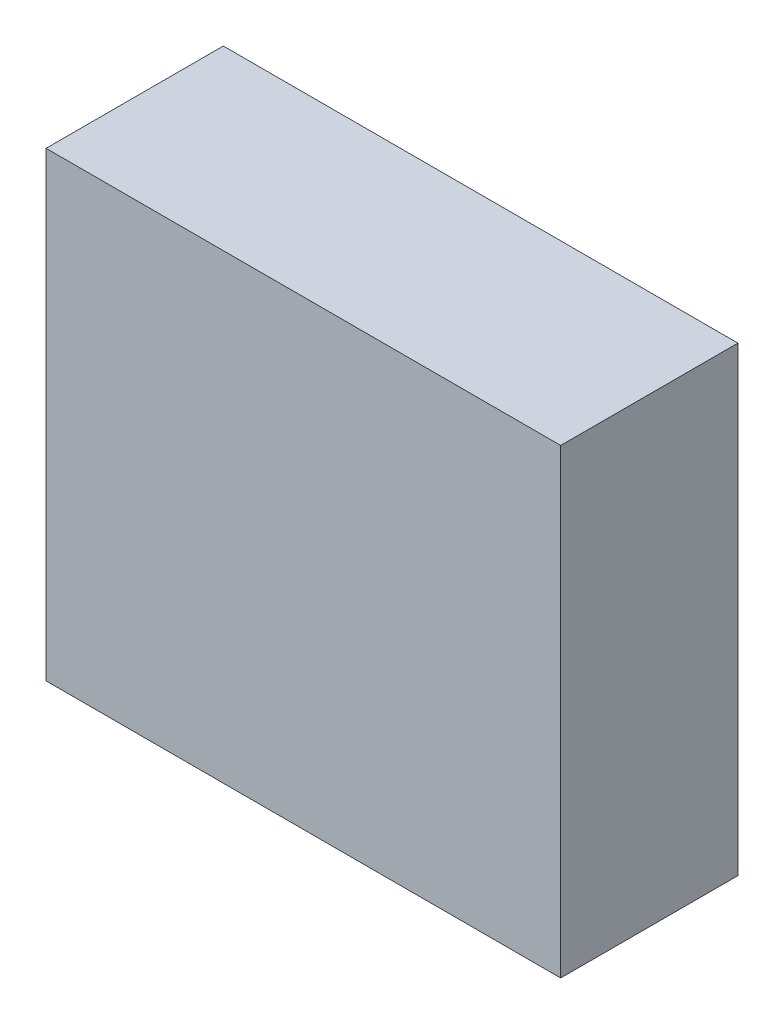
ISO-10303-21;
HEADER;
FILE_DESCRIPTION(('STEP AP214'),'2;1');
FILE_NAME('part.step','',(''),(''),'','','');
FILE_SCHEMA(('AUTOMOTIVE_DESIGN { 1 0 10303 214 1 1 1 1 }'));
ENDSEC;
DATA;
#1=APPLICATION_CONTEXT('core data for automotive mechanical design processes');
#2=APPLICATION_PROTOCOL_DEFINITION('international standard','automotive_design',2000,#1);
#3=PRODUCT_CONTEXT('',#1,'mechanical');
#4=PRODUCT('Part','Part','',(#3));
#5=PRODUCT_RELATED_PRODUCT_CATEGORY('part','',(#4));
#6=PRODUCT_DEFINITION_FORMATION('','',#4);
#7=PRODUCT_DEFINITION_CONTEXT('part definition',#1,'design');
#8=PRODUCT_DEFINITION('design','',#6,#7);
#9=PRODUCT_DEFINITION_SHAPE('','',#8);
#10=(LENGTH_UNIT() NAMED_UNIT(*) SI_UNIT(.MILLI.,.METRE.));
#11=(NAMED_UNIT(*) PLANE_ANGLE_UNIT() SI_UNIT($,.RADIAN.));
#12=(NAMED_UNIT(*) SI_UNIT($,.STERADIAN.) SOLID_ANGLE_UNIT());
#13=UNCERTAINTY_MEASURE_WITH_UNIT(LENGTH_MEASURE(1.E-05),#10,'distance_accuracy_value','');
#14=(GEOMETRIC_REPRESENTATION_CONTEXT(3) GLOBAL_UNCERTAINTY_ASSIGNED_CONTEXT((#13)) GLOBAL_UNIT_ASSIGNED_CONTEXT((#10,
#11,#12)) REPRESENTATION_CONTEXT('',''));
#15=CARTESIAN_POINT('',(0.,0.,0.));
#16=DIRECTION('',(0.,0.,1.));
#17=DIRECTION('',(1.,0.,0.));
#18=AXIS2_PLACEMENT_3D('',#15,#16,#17);
#19=CARTESIAN_POINT('',(0.,0.,15.6));
#20=DIRECTION('',(1.,0.,0.));
#21=DIRECTION('',(0.,0.,-1.));
#22=AXIS2_PLACEMENT_3D('',#19,#20,#21);
#23=PLANE('',#22);
#24=DIRECTION('',(0.,-1.,0.));
#25=VECTOR('',#24,1.);
#26=CARTESIAN_POINT('',(0.,0.,0.));
#27=LINE('',#26,#25);
#28=CARTESIAN_POINT('',(0.,40.6,0.));
#29=VERTEX_POINT('',#28);
#30=CARTESIAN_POINT('',(0.,0.,0.));
#31=VERTEX_POINT('',#30);
#32=EDGE_CURVE('E96',#29,#31,#27,.T.);
#33=ORIENTED_EDGE('',*,*,#32,.T.);
#34=DIRECTION('',(0.,0.,-1.));
#35=VECTOR('',#34,1.);
#36=CARTESIAN_POINT('',(0.,0.,15.6));
#37=LINE('',#36,#35);
#38=CARTESIAN_POINT('',(0.,0.,15.6));
#39=VERTEX_POINT('',#38);
#40=EDGE_CURVE('E11',#39,#31,#37,.T.);
#41=ORIENTED_EDGE('',*,*,#40,.F.);
#42=DIRECTION('',(0.,-1.,0.));
#43=VECTOR('',#42,1.);
#44=CARTESIAN_POINT('',(0.,0.,15.6));
#45=LINE('',#44,#43);
#46=CARTESIAN_POINT('',(0.,40.6,15.6));
#47=VERTEX_POINT('',#46);
#48=EDGE_CURVE('E84',#47,#39,#45,.T.);
#49=ORIENTED_EDGE('',*,*,#48,.F.);
#50=DIRECTION('',(0.,0.,-1.));
#51=VECTOR('',#50,1.);
#52=CARTESIAN_POINT('',(0.,40.6,15.6));
#53=LINE('',#52,#51);
#54=EDGE_CURVE('E92',#47,#29,#53,.T.);
#55=ORIENTED_EDGE('',*,*,#54,.T.);
#56=EDGE_LOOP('',(#33,#41,#49,#55));
#57=FACE_BOUND('',#56,.T.);
#58=ADVANCED_FACE('F33',(#57),#23,.F.);
#59=CARTESIAN_POINT('',(0.,0.,15.6));
#60=DIRECTION('',(0.,1.,0.));
#61=DIRECTION('',(0.,0.,1.));
#62=AXIS2_PLACEMENT_3D('',#59,#60,#61);
#63=PLANE('',#62);
#64=DIRECTION('',(1.,0.,0.));
#65=VECTOR('',#64,1.);
#66=CARTESIAN_POINT('',(0.,0.,0.));
#67=LINE('',#66,#65);
#68=CARTESIAN_POINT('',(45.3,0.,0.));
#69=VERTEX_POINT('',#68);
#70=EDGE_CURVE('E88',#31,#69,#67,.T.);
#71=ORIENTED_EDGE('',*,*,#70,.T.);
#72=DIRECTION('',(0.,0.,-1.));
#73=VECTOR('',#72,1.);
#74=CARTESIAN_POINT('',(45.3,0.,15.6));
#75=LINE('',#74,#73);
#76=CARTESIAN_POINT('',(45.3,0.,15.6));
#77=VERTEX_POINT('',#76);
#78=EDGE_CURVE('E41',#77,#69,#75,.T.);
#79=ORIENTED_EDGE('',*,*,#78,.F.);
#80=DIRECTION('',(1.,0.,0.));
#81=VECTOR('',#80,1.);
#82=CARTESIAN_POINT('',(0.,0.,15.6));
#83=LINE('',#82,#81);
#84=EDGE_CURVE('E79',#39,#77,#83,.T.);
#85=ORIENTED_EDGE('',*,*,#84,.F.);
#86=ORIENTED_EDGE('',*,*,#40,.T.);
#87=EDGE_LOOP('',(#71,#79,#85,#86));
#88=FACE_BOUND('',#87,.T.);
#89=ADVANCED_FACE('F87',(#88),#63,.F.);
#90=CARTESIAN_POINT('',(45.3,0.,15.6));
#91=DIRECTION('',(-1.,0.,0.));
#92=DIRECTION('',(0.,0.,1.));
#93=AXIS2_PLACEMENT_3D('',#90,#91,#92);
#94=PLANE('',#93);
#95=DIRECTION('',(0.,1.,0.));
#96=VECTOR('',#95,1.);
#97=CARTESIAN_POINT('',(45.3,0.,0.));
#98=LINE('',#97,#96);
#99=CARTESIAN_POINT('',(45.3,40.6,0.));
#100=VERTEX_POINT('',#99);
#101=EDGE_CURVE('E66',#69,#100,#98,.T.);
#102=ORIENTED_EDGE('',*,*,#101,.T.);
#103=DIRECTION('',(0.,0.,-1.));
#104=VECTOR('',#103,1.);
#105=CARTESIAN_POINT('',(45.3,40.6,15.6));
#106=LINE('',#105,#104);
#107=CARTESIAN_POINT('',(45.3,40.6,15.6));
#108=VERTEX_POINT('',#107);
#109=EDGE_CURVE('E89',#108,#100,#106,.T.);
#110=ORIENTED_EDGE('',*,*,#109,.F.);
#111=DIRECTION('',(0.,1.,0.));
#112=VECTOR('',#111,1.);
#113=CARTESIAN_POINT('',(45.3,0.,15.6));
#114=LINE('',#113,#112);
#115=EDGE_CURVE('E82',#77,#108,#114,.T.);
#116=ORIENTED_EDGE('',*,*,#115,.F.);
#117=ORIENTED_EDGE('',*,*,#78,.T.);
#118=EDGE_LOOP('',(#102,#110,#116,#117));
#119=FACE_BOUND('',#118,.T.);
#120=ADVANCED_FACE('F90',(#119),#94,.F.);
#121=CARTESIAN_POINT('',(0.,40.6,15.6));
#122=DIRECTION('',(0.,-1.,0.));
#123=DIRECTION('',(0.,0.,-1.));
#124=AXIS2_PLACEMENT_3D('',#121,#122,#123);
#125=PLANE('',#124);
#126=DIRECTION('',(-1.,0.,0.));
#127=VECTOR('',#126,1.);
#128=CARTESIAN_POINT('',(0.,40.6,0.));
#129=LINE('',#128,#127);
#130=EDGE_CURVE('E72',#100,#29,#129,.T.);
#131=ORIENTED_EDGE('',*,*,#130,.T.);
#132=ORIENTED_EDGE('',*,*,#54,.F.);
#133=DIRECTION('',(-1.,0.,0.));
#134=VECTOR('',#133,1.);
#135=CARTESIAN_POINT('',(0.,40.6,15.6));
#136=LINE('',#135,#134);
#137=EDGE_CURVE('E49',#108,#47,#136,.T.);
#138=ORIENTED_EDGE('',*,*,#137,.F.);
#139=ORIENTED_EDGE('',*,*,#109,.T.);
#140=EDGE_LOOP('',(#131,#132,#138,#139));
#141=FACE_BOUND('',#140,.T.);
#142=ADVANCED_FACE('F103',(#141),#125,.F.);
#143=CARTESIAN_POINT('',(0.,0.,15.6));
#144=DIRECTION('',(0.,0.,-1.));
#145=DIRECTION('',(-1.,0.,0.));
#146=AXIS2_PLACEMENT_3D('',#143,#144,#145);
#147=PLANE('',#146);
#148=ORIENTED_EDGE('',*,*,#48,.T.);
#149=ORIENTED_EDGE('',*,*,#84,.T.);
#150=ORIENTED_EDGE('',*,*,#115,.T.);
#151=ORIENTED_EDGE('',*,*,#137,.T.);
#152=EDGE_LOOP('',(#148,#149,#150,#151));
#153=FACE_BOUND('',#152,.T.);
#154=ADVANCED_FACE('F80',(#153),#147,.F.);
#155=CARTESIAN_POINT('',(0.,0.,0.));
#156=DIRECTION('',(0.,0.,-1.));
#157=DIRECTION('',(-1.,0.,0.));
#158=AXIS2_PLACEMENT_3D('',#155,#156,#157);
#159=PLANE('',#158);
#160=ORIENTED_EDGE('',*,*,#32,.F.);
#161=ORIENTED_EDGE('',*,*,#130,.F.);
#162=ORIENTED_EDGE('',*,*,#101,.F.);
#163=ORIENTED_EDGE('',*,*,#70,.F.);
#164=EDGE_LOOP('',(#160,#161,#162,#163));
#165=FACE_BOUND('',#164,.T.);
#166=ADVANCED_FACE('F106',(#165),#159,.T.);
#167=CLOSED_SHELL('',(#58,#89,#120,#142,#154,#166));
#168=MANIFOLD_SOLID_BREP('B2',#167);
#169=ADVANCED_BREP_SHAPE_REPRESENTATION('',(#18,#168),#14);
#170=SHAPE_DEFINITION_REPRESENTATION(#9,#169);
ENDSEC;
END-ISO-10303-21;
